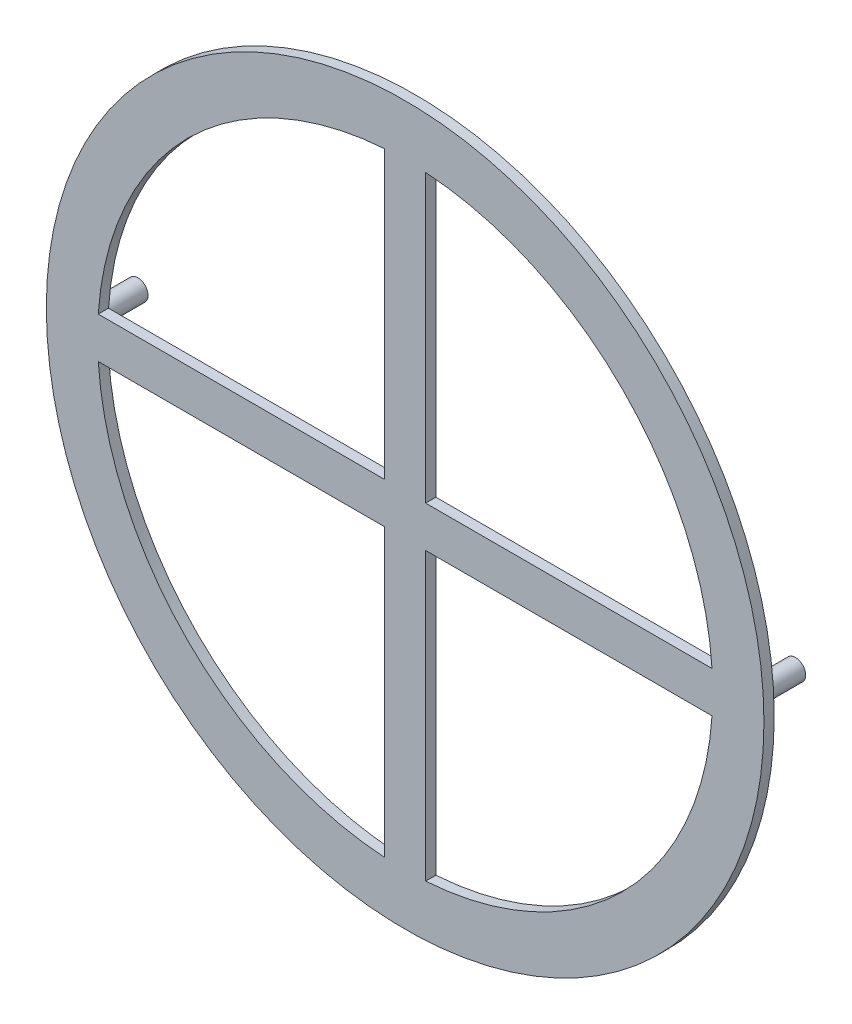
ISO-10303-21;
HEADER;
FILE_DESCRIPTION(('STEP AP214'),'2;1');
FILE_NAME('part.step','',(''),(''),'','','');
FILE_SCHEMA(('AUTOMOTIVE_DESIGN { 1 0 10303 214 1 1 1 1 }'));
ENDSEC;
DATA;
#1=APPLICATION_CONTEXT('core data for automotive mechanical design processes');
#2=APPLICATION_PROTOCOL_DEFINITION('international standard','automotive_design',2000,#1);
#3=PRODUCT_CONTEXT('',#1,'mechanical');
#4=PRODUCT('Part','Part','',(#3));
#5=PRODUCT_RELATED_PRODUCT_CATEGORY('part','',(#4));
#6=PRODUCT_DEFINITION_FORMATION('','',#4);
#7=PRODUCT_DEFINITION_CONTEXT('part definition',#1,'design');
#8=PRODUCT_DEFINITION('design','',#6,#7);
#9=PRODUCT_DEFINITION_SHAPE('','',#8);
#10=(LENGTH_UNIT() NAMED_UNIT(*) SI_UNIT(.MILLI.,.METRE.));
#11=(NAMED_UNIT(*) PLANE_ANGLE_UNIT() SI_UNIT($,.RADIAN.));
#12=(NAMED_UNIT(*) SI_UNIT($,.STERADIAN.) SOLID_ANGLE_UNIT());
#13=UNCERTAINTY_MEASURE_WITH_UNIT(LENGTH_MEASURE(1.E-05),#10,'distance_accuracy_value','');
#14=(GEOMETRIC_REPRESENTATION_CONTEXT(3) GLOBAL_UNCERTAINTY_ASSIGNED_CONTEXT((#13)) GLOBAL_UNIT_ASSIGNED_CONTEXT((#10,
#11,#12)) REPRESENTATION_CONTEXT('',''));
#15=CARTESIAN_POINT('',(0.,0.,0.));
#16=DIRECTION('',(0.,0.,1.));
#17=DIRECTION('',(1.,0.,0.));
#18=AXIS2_PLACEMENT_3D('',#15,#16,#17);
#19=CARTESIAN_POINT('',(0.,0.,0.));
#20=DIRECTION('',(0.,0.,1.));
#21=DIRECTION('',(1.,0.,0.));
#22=AXIS2_PLACEMENT_3D('',#19,#20,#21);
#23=CYLINDRICAL_SURFACE('',#22,30.);
#24=CARTESIAN_POINT('',(0.,0.,-1.));
#25=DIRECTION('',(0.,0.,1.));
#26=DIRECTION('',(1.,0.,0.));
#27=AXIS2_PLACEMENT_3D('',#24,#25,#26);
#28=CIRCLE('',#27,30.);
#29=CARTESIAN_POINT('',(-29.9332590941915,-2.,-1.));
#30=VERTEX_POINT('',#29);
#31=CARTESIAN_POINT('',(-2.,-29.9332590941915,-1.));
#32=VERTEX_POINT('',#31);
#33=EDGE_CURVE('E241',#30,#32,#28,.T.);
#34=ORIENTED_EDGE('',*,*,#33,.F.);
#35=DIRECTION('',(0.,0.,-1.));
#36=VECTOR('',#35,1.);
#37=CARTESIAN_POINT('',(-29.9332590941915,-2.,0.));
#38=LINE('',#37,#36);
#39=CARTESIAN_POINT('',(-29.9332590941915,-2.,0.));
#40=VERTEX_POINT('',#39);
#41=EDGE_CURVE('E190',#40,#30,#38,.T.);
#42=ORIENTED_EDGE('',*,*,#41,.F.);
#43=CARTESIAN_POINT('',(0.,0.,0.));
#44=DIRECTION('',(0.,0.,1.));
#45=DIRECTION('',(1.,0.,0.));
#46=AXIS2_PLACEMENT_3D('',#43,#44,#45);
#47=CIRCLE('',#46,30.);
#48=CARTESIAN_POINT('',(-2.,-29.9332590941915,0.));
#49=VERTEX_POINT('',#48);
#50=EDGE_CURVE('E225',#40,#49,#47,.T.);
#51=ORIENTED_EDGE('',*,*,#50,.T.);
#52=DIRECTION('',(0.,0.,-1.));
#53=VECTOR('',#52,1.);
#54=CARTESIAN_POINT('',(-2.,-29.9332590941915,0.));
#55=LINE('',#54,#53);
#56=EDGE_CURVE('E194',#49,#32,#55,.T.);
#57=ORIENTED_EDGE('',*,*,#56,.T.);
#58=EDGE_LOOP('',(#34,#42,#51,#57));
#59=FACE_BOUND('',#58,.T.);
#60=ADVANCED_FACE('F41',(#59),#23,.F.);
#61=CARTESIAN_POINT('',(2.,-29.9332590941915,-1.));
#62=VERTEX_POINT('',#61);
#63=CARTESIAN_POINT('',(29.9332590941915,-2.00000000000001,-1.));
#64=VERTEX_POINT('',#63);
#65=EDGE_CURVE('E216',#62,#64,#28,.T.);
#66=ORIENTED_EDGE('',*,*,#65,.F.);
#67=DIRECTION('',(0.,0.,-1.));
#68=VECTOR('',#67,1.);
#69=CARTESIAN_POINT('',(2.,-29.9332590941915,0.));
#70=LINE('',#69,#68);
#71=CARTESIAN_POINT('',(2.,-29.9332590941915,0.));
#72=VERTEX_POINT('',#71);
#73=EDGE_CURVE('E197',#72,#62,#70,.T.);
#74=ORIENTED_EDGE('',*,*,#73,.F.);
#75=CARTESIAN_POINT('',(29.9332590941915,-2.00000000000001,0.));
#76=VERTEX_POINT('',#75);
#77=EDGE_CURVE('E219',#72,#76,#47,.T.);
#78=ORIENTED_EDGE('',*,*,#77,.T.);
#79=DIRECTION('',(0.,0.,-1.));
#80=VECTOR('',#79,1.);
#81=CARTESIAN_POINT('',(29.9332590941915,-2.00000000000001,0.));
#82=LINE('',#81,#80);
#83=EDGE_CURVE('E202',#76,#64,#82,.T.);
#84=ORIENTED_EDGE('',*,*,#83,.T.);
#85=EDGE_LOOP('',(#66,#74,#78,#84));
#86=FACE_BOUND('',#85,.T.);
#87=ADVANCED_FACE('F245',(#86),#23,.F.);
#88=DIRECTION('',(0.,0.,-1.));
#89=VECTOR('',#88,1.);
#90=CARTESIAN_POINT('',(-29.9332590941915,2.,0.));
#91=LINE('',#90,#89);
#92=CARTESIAN_POINT('',(-29.9332590941915,2.,0.));
#93=VERTEX_POINT('',#92);
#94=CARTESIAN_POINT('',(-29.9332590941915,2.,-1.));
#95=VERTEX_POINT('',#94);
#96=EDGE_CURVE('E157',#93,#95,#91,.T.);
#97=ORIENTED_EDGE('',*,*,#96,.T.);
#98=CARTESIAN_POINT('',(-2.,29.9332590941915,-1.));
#99=VERTEX_POINT('',#98);
#100=EDGE_CURVE('E220',#99,#95,#28,.T.);
#101=ORIENTED_EDGE('',*,*,#100,.F.);
#102=DIRECTION('',(0.,0.,-1.));
#103=VECTOR('',#102,1.);
#104=CARTESIAN_POINT('',(-2.,29.9332590941915,0.));
#105=LINE('',#104,#103);
#106=CARTESIAN_POINT('',(-2.,29.9332590941915,0.));
#107=VERTEX_POINT('',#106);
#108=EDGE_CURVE('E142',#107,#99,#105,.T.);
#109=ORIENTED_EDGE('',*,*,#108,.F.);
#110=EDGE_CURVE('E152',#107,#93,#47,.T.);
#111=ORIENTED_EDGE('',*,*,#110,.T.);
#112=EDGE_LOOP('',(#97,#101,#109,#111));
#113=FACE_BOUND('',#112,.T.);
#114=ADVANCED_FACE('F265',(#113),#23,.F.);
#115=DIRECTION('',(0.,0.,-1.));
#116=VECTOR('',#115,1.);
#117=CARTESIAN_POINT('',(29.9332590941915,1.99999999999999,0.));
#118=LINE('',#117,#116);
#119=CARTESIAN_POINT('',(29.9332590941915,1.99999999999999,0.));
#120=VERTEX_POINT('',#119);
#121=CARTESIAN_POINT('',(29.9332590941915,1.99999999999999,-1.));
#122=VERTEX_POINT('',#121);
#123=EDGE_CURVE('E205',#120,#122,#118,.T.);
#124=ORIENTED_EDGE('',*,*,#123,.F.);
#125=CARTESIAN_POINT('',(2.,29.9332590941915,0.));
#126=VERTEX_POINT('',#125);
#127=EDGE_CURVE('E49',#120,#126,#47,.T.);
#128=ORIENTED_EDGE('',*,*,#127,.T.);
#129=DIRECTION('',(0.,0.,-1.));
#130=VECTOR('',#129,1.);
#131=CARTESIAN_POINT('',(2.,29.9332590941915,0.));
#132=LINE('',#131,#130);
#133=CARTESIAN_POINT('',(2.,29.9332590941915,-1.));
#134=VERTEX_POINT('',#133);
#135=EDGE_CURVE('E210',#126,#134,#132,.T.);
#136=ORIENTED_EDGE('',*,*,#135,.T.);
#137=EDGE_CURVE('E217',#122,#134,#28,.T.);
#138=ORIENTED_EDGE('',*,*,#137,.F.);
#139=EDGE_LOOP('',(#124,#128,#136,#138));
#140=FACE_BOUND('',#139,.T.);
#141=ADVANCED_FACE('F259',(#140),#23,.F.);
#142=CARTESIAN_POINT('',(0.,0.,0.));
#143=DIRECTION('',(0.,0.,1.));
#144=DIRECTION('',(1.,0.,0.));
#145=AXIS2_PLACEMENT_3D('',#142,#143,#144);
#146=CYLINDRICAL_SURFACE('',#145,35.);
#147=CARTESIAN_POINT('',(0.,0.,-1.));
#148=DIRECTION('',(0.,0.,1.));
#149=DIRECTION('',(1.,0.,0.));
#150=AXIS2_PLACEMENT_3D('',#147,#148,#149);
#151=CIRCLE('',#150,35.);
#152=CARTESIAN_POINT('',(35.,0.,-1.));
#153=VERTEX_POINT('',#152);
#154=EDGE_CURVE('E189',#153,#153,#151,.T.);
#155=ORIENTED_EDGE('',*,*,#154,.T.);
#156=EDGE_LOOP('',(#155));
#157=FACE_BOUND('',#156,.T.);
#158=CARTESIAN_POINT('',(0.,0.,0.));
#159=DIRECTION('',(0.,0.,1.));
#160=DIRECTION('',(1.,0.,0.));
#161=AXIS2_PLACEMENT_3D('',#158,#159,#160);
#162=CIRCLE('',#161,35.);
#163=CARTESIAN_POINT('',(35.,0.,0.));
#164=VERTEX_POINT('',#163);
#165=EDGE_CURVE('E11',#164,#164,#162,.T.);
#166=ORIENTED_EDGE('',*,*,#165,.F.);
#167=EDGE_LOOP('',(#166));
#168=FACE_BOUND('',#167,.T.);
#169=ADVANCED_FACE('F43',(#157,#168),#146,.T.);
#170=CARTESIAN_POINT('',(30.,0.,0.));
#171=DIRECTION('',(0.,0.,1.));
#172=DIRECTION('',(1.,0.,0.));
#173=AXIS2_PLACEMENT_3D('',#170,#171,#172);
#174=PLANE('',#173);
#175=ORIENTED_EDGE('',*,*,#110,.F.);
#176=DIRECTION('',(0.,1.,0.));
#177=VECTOR('',#176,1.);
#178=CARTESIAN_POINT('',(-2.,0.,0.));
#179=LINE('',#178,#177);
#180=CARTESIAN_POINT('',(-2.,1.99999999999999,0.));
#181=VERTEX_POINT('',#180);
#182=EDGE_CURVE('E136',#181,#107,#179,.T.);
#183=ORIENTED_EDGE('',*,*,#182,.F.);
#184=DIRECTION('',(1.,0.,0.));
#185=VECTOR('',#184,1.);
#186=CARTESIAN_POINT('',(0.,1.99999999999999,0.));
#187=LINE('',#186,#185);
#188=EDGE_CURVE('E150',#93,#181,#187,.T.);
#189=ORIENTED_EDGE('',*,*,#188,.F.);
#190=EDGE_LOOP('',(#175,#183,#189));
#191=FACE_BOUND('',#190,.T.);
#192=ORIENTED_EDGE('',*,*,#127,.F.);
#193=DIRECTION('',(1.,0.,0.));
#194=VECTOR('',#193,1.);
#195=CARTESIAN_POINT('',(0.,2.,0.));
#196=LINE('',#195,#194);
#197=CARTESIAN_POINT('',(2.,2.,0.));
#198=VERTEX_POINT('',#197);
#199=EDGE_CURVE('E166',#198,#120,#196,.T.);
#200=ORIENTED_EDGE('',*,*,#199,.F.);
#201=DIRECTION('',(0.,1.,0.));
#202=VECTOR('',#201,1.);
#203=CARTESIAN_POINT('',(2.,0.,0.));
#204=LINE('',#203,#202);
#205=EDGE_CURVE('E153',#198,#126,#204,.T.);
#206=ORIENTED_EDGE('',*,*,#205,.T.);
#207=EDGE_LOOP('',(#192,#200,#206));
#208=FACE_BOUND('',#207,.T.);
#209=ORIENTED_EDGE('',*,*,#77,.F.);
#210=DIRECTION('',(0.,1.,0.));
#211=VECTOR('',#210,1.);
#212=CARTESIAN_POINT('',(2.00000000000001,0.,0.));
#213=LINE('',#212,#211);
#214=CARTESIAN_POINT('',(2.,-2.,0.));
#215=VERTEX_POINT('',#214);
#216=EDGE_CURVE('E170',#72,#215,#213,.T.);
#217=ORIENTED_EDGE('',*,*,#216,.T.);
#218=DIRECTION('',(1.,0.,0.));
#219=VECTOR('',#218,1.);
#220=CARTESIAN_POINT('',(0.,-2.,0.));
#221=LINE('',#220,#219);
#222=EDGE_CURVE('E168',#215,#76,#221,.T.);
#223=ORIENTED_EDGE('',*,*,#222,.T.);
#224=EDGE_LOOP('',(#209,#217,#223));
#225=FACE_BOUND('',#224,.T.);
#226=ORIENTED_EDGE('',*,*,#165,.T.);
#227=EDGE_LOOP('',(#226));
#228=FACE_BOUND('',#227,.T.);
#229=DIRECTION('',(0.,1.,0.));
#230=VECTOR('',#229,1.);
#231=CARTESIAN_POINT('',(-2.,0.,0.));
#232=LINE('',#231,#230);
#233=CARTESIAN_POINT('',(-2.,-2.,0.));
#234=VERTEX_POINT('',#233);
#235=EDGE_CURVE('E172',#49,#234,#232,.T.);
#236=ORIENTED_EDGE('',*,*,#235,.F.);
#237=ORIENTED_EDGE('',*,*,#50,.F.);
#238=DIRECTION('',(1.,0.,0.));
#239=VECTOR('',#238,1.);
#240=CARTESIAN_POINT('',(0.,-2.,0.));
#241=LINE('',#240,#239);
#242=EDGE_CURVE('E143',#40,#234,#241,.T.);
#243=ORIENTED_EDGE('',*,*,#242,.T.);
#244=EDGE_LOOP('',(#236,#237,#243));
#245=FACE_BOUND('',#244,.T.);
#246=ADVANCED_FACE('F148',(#191,#208,#225,#228,#245),#174,.T.);
#247=CARTESIAN_POINT('',(30.,0.,-1.));
#248=DIRECTION('',(0.,0.,-1.));
#249=DIRECTION('',(-1.,0.,0.));
#250=AXIS2_PLACEMENT_3D('',#247,#248,#249);
#251=PLANE('',#250);
#252=CARTESIAN_POINT('',(-32.0718984887697,0.,-1.));
#253=DIRECTION('',(0.,0.,-1.));
#254=DIRECTION('',(1.,0.,0.));
#255=AXIS2_PLACEMENT_3D('',#252,#253,#254);
#256=CIRCLE('',#255,1.);
#257=CARTESIAN_POINT('',(-31.0718984887697,0.,-1.));
#258=VERTEX_POINT('',#257);
#259=EDGE_CURVE('E319',#258,#258,#256,.T.);
#260=ORIENTED_EDGE('',*,*,#259,.F.);
#261=EDGE_LOOP('',(#260));
#262=FACE_BOUND('',#261,.T.);
#263=CARTESIAN_POINT('',(32.0718984887697,0.,-1.));
#264=DIRECTION('',(0.,0.,-1.));
#265=DIRECTION('',(-1.,0.,0.));
#266=AXIS2_PLACEMENT_3D('',#263,#264,#265);
#267=CIRCLE('',#266,1.);
#268=CARTESIAN_POINT('',(31.0718984887697,0.,-1.));
#269=VERTEX_POINT('',#268);
#270=EDGE_CURVE('E162',#269,#269,#267,.T.);
#271=ORIENTED_EDGE('',*,*,#270,.F.);
#272=EDGE_LOOP('',(#271));
#273=FACE_BOUND('',#272,.T.);
#274=DIRECTION('',(1.,0.,0.));
#275=VECTOR('',#274,1.);
#276=CARTESIAN_POINT('',(0.,-2.,-1.));
#277=LINE('',#276,#275);
#278=CARTESIAN_POINT('',(-2.,-2.,-1.));
#279=VERTEX_POINT('',#278);
#280=EDGE_CURVE('E64',#30,#279,#277,.T.);
#281=ORIENTED_EDGE('',*,*,#280,.F.);
#282=ORIENTED_EDGE('',*,*,#33,.T.);
#283=DIRECTION('',(0.,1.,0.));
#284=VECTOR('',#283,1.);
#285=CARTESIAN_POINT('',(-2.,0.,-1.));
#286=LINE('',#285,#284);
#287=EDGE_CURVE('E159',#32,#279,#286,.T.);
#288=ORIENTED_EDGE('',*,*,#287,.T.);
#289=EDGE_LOOP('',(#281,#282,#288));
#290=FACE_BOUND('',#289,.T.);
#291=DIRECTION('',(0.,1.,0.));
#292=VECTOR('',#291,1.);
#293=CARTESIAN_POINT('',(2.00000000000001,0.,-1.));
#294=LINE('',#293,#292);
#295=CARTESIAN_POINT('',(2.,-2.,-1.));
#296=VERTEX_POINT('',#295);
#297=EDGE_CURVE('E56',#62,#296,#294,.T.);
#298=ORIENTED_EDGE('',*,*,#297,.F.);
#299=ORIENTED_EDGE('',*,*,#65,.T.);
#300=DIRECTION('',(1.,0.,0.));
#301=VECTOR('',#300,1.);
#302=CARTESIAN_POINT('',(0.,-2.,-1.));
#303=LINE('',#302,#301);
#304=EDGE_CURVE('E184',#296,#64,#303,.T.);
#305=ORIENTED_EDGE('',*,*,#304,.F.);
#306=EDGE_LOOP('',(#298,#299,#305));
#307=FACE_BOUND('',#306,.T.);
#308=DIRECTION('',(1.,0.,0.));
#309=VECTOR('',#308,1.);
#310=CARTESIAN_POINT('',(0.,2.,-1.));
#311=LINE('',#310,#309);
#312=CARTESIAN_POINT('',(2.,2.,-1.));
#313=VERTEX_POINT('',#312);
#314=EDGE_CURVE('E182',#313,#122,#311,.T.);
#315=ORIENTED_EDGE('',*,*,#314,.T.);
#316=ORIENTED_EDGE('',*,*,#137,.T.);
#317=DIRECTION('',(0.,1.,0.));
#318=VECTOR('',#317,1.);
#319=CARTESIAN_POINT('',(2.,0.,-1.));
#320=LINE('',#319,#318);
#321=EDGE_CURVE('E180',#313,#134,#320,.T.);
#322=ORIENTED_EDGE('',*,*,#321,.F.);
#323=EDGE_LOOP('',(#315,#316,#322));
#324=FACE_BOUND('',#323,.T.);
#325=ORIENTED_EDGE('',*,*,#100,.T.);
#326=DIRECTION('',(1.,0.,0.));
#327=VECTOR('',#326,1.);
#328=CARTESIAN_POINT('',(0.,1.99999999999999,-1.));
#329=LINE('',#328,#327);
#330=CARTESIAN_POINT('',(-2.,1.99999999999999,-1.));
#331=VERTEX_POINT('',#330);
#332=EDGE_CURVE('E176',#95,#331,#329,.T.);
#333=ORIENTED_EDGE('',*,*,#332,.T.);
#334=DIRECTION('',(0.,1.,0.));
#335=VECTOR('',#334,1.);
#336=CARTESIAN_POINT('',(-2.,0.,-1.));
#337=LINE('',#336,#335);
#338=EDGE_CURVE('E138',#331,#99,#337,.T.);
#339=ORIENTED_EDGE('',*,*,#338,.T.);
#340=EDGE_LOOP('',(#325,#333,#339));
#341=FACE_BOUND('',#340,.T.);
#342=ORIENTED_EDGE('',*,*,#154,.F.);
#343=EDGE_LOOP('',(#342));
#344=FACE_BOUND('',#343,.T.);
#345=ADVANCED_FACE('F240',(#262,#273,#290,#307,#324,#341,#344),#251,.T.);
#346=CARTESIAN_POINT('',(0.,1.99999999999999,0.));
#347=DIRECTION('',(0.,1.,0.));
#348=DIRECTION('',(-1.,0.,0.));
#349=AXIS2_PLACEMENT_3D('',#346,#347,#348);
#350=PLANE('',#349);
#351=ORIENTED_EDGE('',*,*,#332,.F.);
#352=ORIENTED_EDGE('',*,*,#96,.F.);
#353=ORIENTED_EDGE('',*,*,#188,.T.);
#354=DIRECTION('',(0.,0.,-1.));
#355=VECTOR('',#354,1.);
#356=CARTESIAN_POINT('',(-2.,1.99999999999999,0.));
#357=LINE('',#356,#355);
#358=EDGE_CURVE('E132',#181,#331,#357,.T.);
#359=ORIENTED_EDGE('',*,*,#358,.T.);
#360=EDGE_LOOP('',(#351,#352,#353,#359));
#361=FACE_BOUND('',#360,.T.);
#362=ADVANCED_FACE('F155',(#361),#350,.T.);
#363=CARTESIAN_POINT('',(0.,-2.,0.));
#364=DIRECTION('',(0.,1.,0.));
#365=DIRECTION('',(-1.,0.,0.));
#366=AXIS2_PLACEMENT_3D('',#363,#364,#365);
#367=PLANE('',#366);
#368=ORIENTED_EDGE('',*,*,#280,.T.);
#369=DIRECTION('',(0.,0.,-1.));
#370=VECTOR('',#369,1.);
#371=CARTESIAN_POINT('',(-2.,-2.,0.));
#372=LINE('',#371,#370);
#373=EDGE_CURVE('E192',#234,#279,#372,.T.);
#374=ORIENTED_EDGE('',*,*,#373,.F.);
#375=ORIENTED_EDGE('',*,*,#242,.F.);
#376=ORIENTED_EDGE('',*,*,#41,.T.);
#377=EDGE_LOOP('',(#368,#374,#375,#376));
#378=FACE_BOUND('',#377,.T.);
#379=ADVANCED_FACE('F276',(#378),#367,.F.);
#380=CARTESIAN_POINT('',(-2.,0.,0.));
#381=DIRECTION('',(-1.,0.,0.));
#382=DIRECTION('',(0.,-1.,0.));
#383=AXIS2_PLACEMENT_3D('',#380,#381,#382);
#384=PLANE('',#383);
#385=ORIENTED_EDGE('',*,*,#287,.F.);
#386=ORIENTED_EDGE('',*,*,#56,.F.);
#387=ORIENTED_EDGE('',*,*,#235,.T.);
#388=ORIENTED_EDGE('',*,*,#373,.T.);
#389=EDGE_LOOP('',(#385,#386,#387,#388));
#390=FACE_BOUND('',#389,.T.);
#391=ADVANCED_FACE('F239',(#390),#384,.T.);
#392=CARTESIAN_POINT('',(2.00000000000001,0.,0.));
#393=DIRECTION('',(-1.,0.,0.));
#394=DIRECTION('',(0.,-1.,0.));
#395=AXIS2_PLACEMENT_3D('',#392,#393,#394);
#396=PLANE('',#395);
#397=ORIENTED_EDGE('',*,*,#297,.T.);
#398=DIRECTION('',(0.,0.,-1.));
#399=VECTOR('',#398,1.);
#400=CARTESIAN_POINT('',(2.,-2.,0.));
#401=LINE('',#400,#399);
#402=EDGE_CURVE('E199',#215,#296,#401,.T.);
#403=ORIENTED_EDGE('',*,*,#402,.F.);
#404=ORIENTED_EDGE('',*,*,#216,.F.);
#405=ORIENTED_EDGE('',*,*,#73,.T.);
#406=EDGE_LOOP('',(#397,#403,#404,#405));
#407=FACE_BOUND('',#406,.T.);
#408=ADVANCED_FACE('F252',(#407),#396,.F.);
#409=CARTESIAN_POINT('',(0.,-2.,0.));
#410=DIRECTION('',(0.,1.,0.));
#411=DIRECTION('',(-1.,0.,0.));
#412=AXIS2_PLACEMENT_3D('',#409,#410,#411);
#413=PLANE('',#412);
#414=ORIENTED_EDGE('',*,*,#304,.T.);
#415=ORIENTED_EDGE('',*,*,#83,.F.);
#416=ORIENTED_EDGE('',*,*,#222,.F.);
#417=ORIENTED_EDGE('',*,*,#402,.T.);
#418=EDGE_LOOP('',(#414,#415,#416,#417));
#419=FACE_BOUND('',#418,.T.);
#420=ADVANCED_FACE('F249',(#419),#413,.F.);
#421=CARTESIAN_POINT('',(0.,2.,0.));
#422=DIRECTION('',(0.,1.,0.));
#423=DIRECTION('',(-1.,0.,0.));
#424=AXIS2_PLACEMENT_3D('',#421,#422,#423);
#425=PLANE('',#424);
#426=ORIENTED_EDGE('',*,*,#314,.F.);
#427=DIRECTION('',(0.,0.,-1.));
#428=VECTOR('',#427,1.);
#429=CARTESIAN_POINT('',(2.,2.,0.));
#430=LINE('',#429,#428);
#431=EDGE_CURVE('E208',#198,#313,#430,.T.);
#432=ORIENTED_EDGE('',*,*,#431,.F.);
#433=ORIENTED_EDGE('',*,*,#199,.T.);
#434=ORIENTED_EDGE('',*,*,#123,.T.);
#435=EDGE_LOOP('',(#426,#432,#433,#434));
#436=FACE_BOUND('',#435,.T.);
#437=ADVANCED_FACE('F283',(#436),#425,.T.);
#438=CARTESIAN_POINT('',(2.,0.,0.));
#439=DIRECTION('',(-1.,0.,0.));
#440=DIRECTION('',(0.,0.,1.));
#441=AXIS2_PLACEMENT_3D('',#438,#439,#440);
#442=PLANE('',#441);
#443=ORIENTED_EDGE('',*,*,#321,.T.);
#444=ORIENTED_EDGE('',*,*,#135,.F.);
#445=ORIENTED_EDGE('',*,*,#205,.F.);
#446=ORIENTED_EDGE('',*,*,#431,.T.);
#447=EDGE_LOOP('',(#443,#444,#445,#446));
#448=FACE_BOUND('',#447,.T.);
#449=ADVANCED_FACE('F280',(#448),#442,.F.);
#450=CARTESIAN_POINT('',(-2.,0.,0.));
#451=DIRECTION('',(-1.,0.,0.));
#452=DIRECTION('',(0.,-1.,0.));
#453=AXIS2_PLACEMENT_3D('',#450,#451,#452);
#454=PLANE('',#453);
#455=ORIENTED_EDGE('',*,*,#338,.F.);
#456=ORIENTED_EDGE('',*,*,#358,.F.);
#457=ORIENTED_EDGE('',*,*,#182,.T.);
#458=ORIENTED_EDGE('',*,*,#108,.T.);
#459=EDGE_LOOP('',(#455,#456,#457,#458));
#460=FACE_BOUND('',#459,.T.);
#461=ADVANCED_FACE('F134',(#460),#454,.T.);
#462=CARTESIAN_POINT('',(32.0718984887697,0.,-6.));
#463=DIRECTION('',(0.,0.,1.));
#464=DIRECTION('',(1.,0.,0.));
#465=AXIS2_PLACEMENT_3D('',#462,#463,#464);
#466=CYLINDRICAL_SURFACE('',#465,1.);
#467=CARTESIAN_POINT('',(32.0718984887697,0.,-6.));
#468=DIRECTION('',(0.,0.,-1.));
#469=DIRECTION('',(-1.,0.,0.));
#470=AXIS2_PLACEMENT_3D('',#467,#468,#469);
#471=CIRCLE('',#470,1.);
#472=CARTESIAN_POINT('',(31.0718984887697,0.,-6.));
#473=VERTEX_POINT('',#472);
#474=EDGE_CURVE('E178',#473,#473,#471,.T.);
#475=ORIENTED_EDGE('',*,*,#474,.F.);
#476=EDGE_LOOP('',(#475));
#477=FACE_BOUND('',#476,.T.);
#478=ORIENTED_EDGE('',*,*,#270,.T.);
#479=EDGE_LOOP('',(#478));
#480=FACE_BOUND('',#479,.T.);
#481=ADVANCED_FACE('F279',(#477,#480),#466,.T.);
#482=CARTESIAN_POINT('',(32.0718984887697,0.,-6.));
#483=DIRECTION('',(0.,0.,-1.));
#484=DIRECTION('',(-1.,0.,0.));
#485=AXIS2_PLACEMENT_3D('',#482,#483,#484);
#486=PLANE('',#485);
#487=ORIENTED_EDGE('',*,*,#474,.T.);
#488=EDGE_LOOP('',(#487));
#489=FACE_BOUND('',#488,.T.);
#490=ADVANCED_FACE('F299',(#489),#486,.T.);
#491=CARTESIAN_POINT('',(-32.0718984887697,0.,-6.));
#492=DIRECTION('',(0.,0.,1.));
#493=DIRECTION('',(1.,0.,0.));
#494=AXIS2_PLACEMENT_3D('',#491,#492,#493);
#495=CYLINDRICAL_SURFACE('',#494,1.);
#496=CARTESIAN_POINT('',(-32.0718984887697,0.,-6.));
#497=DIRECTION('',(0.,0.,-1.));
#498=DIRECTION('',(1.,0.,0.));
#499=AXIS2_PLACEMENT_3D('',#496,#497,#498);
#500=CIRCLE('',#499,1.);
#501=CARTESIAN_POINT('',(-31.0718984887697,0.,-6.));
#502=VERTEX_POINT('',#501);
#503=EDGE_CURVE('E316',#502,#502,#500,.T.);
#504=ORIENTED_EDGE('',*,*,#503,.F.);
#505=EDGE_LOOP('',(#504));
#506=FACE_BOUND('',#505,.T.);
#507=ORIENTED_EDGE('',*,*,#259,.T.);
#508=EDGE_LOOP('',(#507));
#509=FACE_BOUND('',#508,.T.);
#510=ADVANCED_FACE('F303',(#506,#509),#495,.T.);
#511=CARTESIAN_POINT('',(-32.0718984887697,0.,-6.));
#512=DIRECTION('',(0.,0.,1.));
#513=DIRECTION('',(1.,0.,0.));
#514=AXIS2_PLACEMENT_3D('',#511,#512,#513);
#515=PLANE('',#514);
#516=ORIENTED_EDGE('',*,*,#503,.T.);
#517=EDGE_LOOP('',(#516));
#518=FACE_BOUND('',#517,.T.);
#519=ADVANCED_FACE('F305',(#518),#515,.F.);
#520=CLOSED_SHELL('',(#60,#87,#114,#141,#169,#246,#345,#362,#379,#391,#408,#420,#437,#449,#461,
#481,#490,#510,#519));
#521=MANIFOLD_SOLID_BREP('B2',#520);
#522=ADVANCED_BREP_SHAPE_REPRESENTATION('',(#18,#521),#14);
#523=SHAPE_DEFINITION_REPRESENTATION(#9,#522);
ENDSEC;
END-ISO-10303-21;
